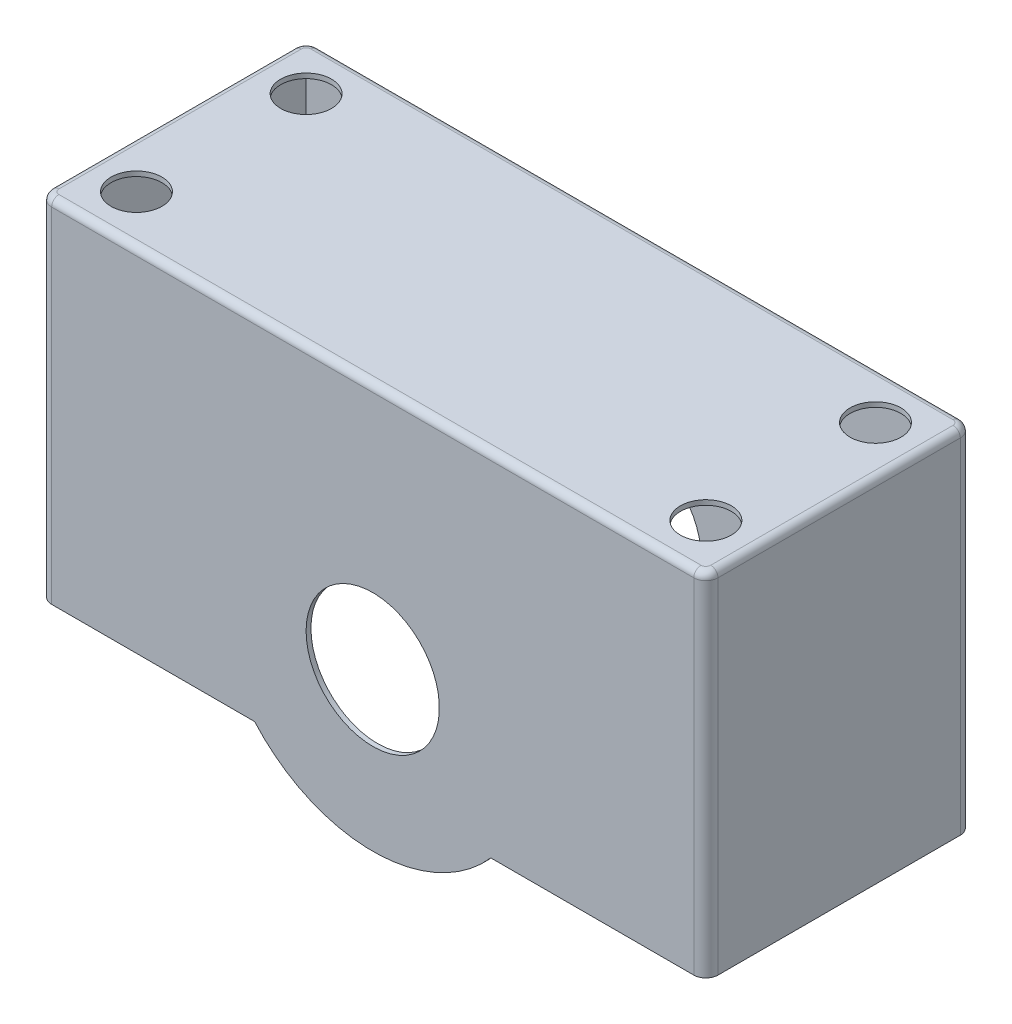
ISO-10303-21;
HEADER;
FILE_DESCRIPTION(('STEP AP214'),'2;1');
FILE_NAME('part.step','',(''),(''),'','','');
FILE_SCHEMA(('AUTOMOTIVE_DESIGN { 1 0 10303 214 1 1 1 1 }'));
ENDSEC;
DATA;
#1=APPLICATION_CONTEXT('core data for automotive mechanical design processes');
#2=APPLICATION_PROTOCOL_DEFINITION('international standard','automotive_design',2000,#1);
#3=PRODUCT_CONTEXT('',#1,'mechanical');
#4=PRODUCT('Part','Part','',(#3));
#5=PRODUCT_RELATED_PRODUCT_CATEGORY('part','',(#4));
#6=PRODUCT_DEFINITION_FORMATION('','',#4);
#7=PRODUCT_DEFINITION_CONTEXT('part definition',#1,'design');
#8=PRODUCT_DEFINITION('design','',#6,#7);
#9=PRODUCT_DEFINITION_SHAPE('','',#8);
#10=(LENGTH_UNIT() NAMED_UNIT(*) SI_UNIT(.MILLI.,.METRE.));
#11=(NAMED_UNIT(*) PLANE_ANGLE_UNIT() SI_UNIT($,.RADIAN.));
#12=(NAMED_UNIT(*) SI_UNIT($,.STERADIAN.) SOLID_ANGLE_UNIT());
#13=UNCERTAINTY_MEASURE_WITH_UNIT(LENGTH_MEASURE(1.E-05),#10,'distance_accuracy_value','');
#14=(GEOMETRIC_REPRESENTATION_CONTEXT(3) GLOBAL_UNCERTAINTY_ASSIGNED_CONTEXT((#13)) GLOBAL_UNIT_ASSIGNED_CONTEXT((#10,
#11,#12)) REPRESENTATION_CONTEXT('',''));
#15=CARTESIAN_POINT('',(0.,0.,0.));
#16=DIRECTION('',(0.,0.,1.));
#17=DIRECTION('',(1.,0.,0.));
#18=AXIS2_PLACEMENT_3D('',#15,#16,#17);
#19=CARTESIAN_POINT('',(-137.5,72.5,55.));
#20=DIRECTION('',(0.,-1.,0.));
#21=DIRECTION('',(0.,0.,-1.));
#22=AXIS2_PLACEMENT_3D('',#19,#20,#21);
#23=PLANE('',#22);
#24=CARTESIAN_POINT('',(-117.5,72.5,35.));
#25=DIRECTION('',(0.,1.,0.));
#26=DIRECTION('',(0.,0.,1.));
#27=AXIS2_PLACEMENT_3D('',#24,#25,#26);
#28=CIRCLE('',#27,10.5);
#29=CARTESIAN_POINT('',(-117.5,72.5,45.5));
#30=VERTEX_POINT('',#29);
#31=EDGE_CURVE('E673',#30,#30,#28,.T.);
#32=ORIENTED_EDGE('',*,*,#31,.F.);
#33=EDGE_LOOP('',(#32));
#34=FACE_BOUND('',#33,.T.);
#35=CARTESIAN_POINT('',(117.5,72.5,-35.));
#36=DIRECTION('',(0.,1.,0.));
#37=DIRECTION('',(0.,0.,-1.));
#38=AXIS2_PLACEMENT_3D('',#35,#36,#37);
#39=CIRCLE('',#38,10.5);
#40=CARTESIAN_POINT('',(117.5,72.5,-45.5));
#41=VERTEX_POINT('',#40);
#42=EDGE_CURVE('E674',#41,#41,#39,.T.);
#43=ORIENTED_EDGE('',*,*,#42,.F.);
#44=EDGE_LOOP('',(#43));
#45=FACE_BOUND('',#44,.T.);
#46=CARTESIAN_POINT('',(117.5,72.5,35.));
#47=DIRECTION('',(0.,1.,0.));
#48=DIRECTION('',(0.,0.,-1.));
#49=AXIS2_PLACEMENT_3D('',#46,#47,#48);
#50=CIRCLE('',#49,10.5);
#51=CARTESIAN_POINT('',(117.5,72.5,24.5));
#52=VERTEX_POINT('',#51);
#53=EDGE_CURVE('E355',#52,#52,#50,.T.);
#54=ORIENTED_EDGE('',*,*,#53,.F.);
#55=EDGE_LOOP('',(#54));
#56=FACE_BOUND('',#55,.T.);
#57=CARTESIAN_POINT('',(-117.5,72.5,-35.));
#58=DIRECTION('',(0.,1.,0.));
#59=DIRECTION('',(0.,0.,1.));
#60=AXIS2_PLACEMENT_3D('',#57,#58,#59);
#61=CIRCLE('',#60,10.5);
#62=CARTESIAN_POINT('',(-117.5,72.5,-24.5));
#63=VERTEX_POINT('',#62);
#64=EDGE_CURVE('E272',#63,#63,#61,.T.);
#65=ORIENTED_EDGE('',*,*,#64,.F.);
#66=EDGE_LOOP('',(#65));
#67=FACE_BOUND('',#66,.T.);
#68=CARTESIAN_POINT('',(-132.5,72.5,50.));
#69=DIRECTION('',(0.,-1.,0.));
#70=DIRECTION('',(0.,0.,-1.));
#71=AXIS2_PLACEMENT_3D('',#68,#69,#70);
#72=CIRCLE('',#71,2.);
#73=CARTESIAN_POINT('',(-132.5,72.5,52.));
#74=VERTEX_POINT('',#73);
#75=CARTESIAN_POINT('',(-134.5,72.5,50.));
#76=VERTEX_POINT('',#75);
#77=EDGE_CURVE('E318',#74,#76,#72,.T.);
#78=ORIENTED_EDGE('',*,*,#77,.F.);
#79=DIRECTION('',(-1.,0.,0.));
#80=VECTOR('',#79,1.);
#81=CARTESIAN_POINT('',(137.5,72.5,52.));
#82=LINE('',#81,#80);
#83=CARTESIAN_POINT('',(132.5,72.5,52.));
#84=VERTEX_POINT('',#83);
#85=EDGE_CURVE('E284',#74,#84,#82,.F.);
#86=ORIENTED_EDGE('',*,*,#85,.T.);
#87=CARTESIAN_POINT('',(132.5,72.5,50.));
#88=DIRECTION('',(0.,-1.,0.));
#89=DIRECTION('',(0.,0.,-1.));
#90=AXIS2_PLACEMENT_3D('',#87,#88,#89);
#91=CIRCLE('',#90,2.);
#92=CARTESIAN_POINT('',(134.5,72.5,50.));
#93=VERTEX_POINT('',#92);
#94=EDGE_CURVE('E316',#93,#84,#91,.T.);
#95=ORIENTED_EDGE('',*,*,#94,.F.);
#96=DIRECTION('',(0.,0.,-1.));
#97=VECTOR('',#96,1.);
#98=CARTESIAN_POINT('',(134.5,72.5,55.));
#99=LINE('',#98,#97);
#100=CARTESIAN_POINT('',(134.5,72.5,-50.));
#101=VERTEX_POINT('',#100);
#102=EDGE_CURVE('E290',#93,#101,#99,.T.);
#103=ORIENTED_EDGE('',*,*,#102,.T.);
#104=CARTESIAN_POINT('',(132.5,72.5,-50.));
#105=DIRECTION('',(0.,-1.,0.));
#106=DIRECTION('',(0.,0.,-1.));
#107=AXIS2_PLACEMENT_3D('',#104,#105,#106);
#108=CIRCLE('',#107,2.);
#109=CARTESIAN_POINT('',(132.5,72.5,-52.));
#110=VERTEX_POINT('',#109);
#111=EDGE_CURVE('E313',#110,#101,#108,.T.);
#112=ORIENTED_EDGE('',*,*,#111,.F.);
#113=DIRECTION('',(-1.,0.,0.));
#114=VECTOR('',#113,1.);
#115=CARTESIAN_POINT('',(-137.5,72.5,-52.));
#116=LINE('',#115,#114);
#117=CARTESIAN_POINT('',(-132.5,72.5,-52.));
#118=VERTEX_POINT('',#117);
#119=EDGE_CURVE('E287',#110,#118,#116,.T.);
#120=ORIENTED_EDGE('',*,*,#119,.T.);
#121=CARTESIAN_POINT('',(-132.5,72.5,-50.));
#122=DIRECTION('',(0.,-1.,0.));
#123=DIRECTION('',(0.,0.,-1.));
#124=AXIS2_PLACEMENT_3D('',#121,#122,#123);
#125=CIRCLE('',#124,2.);
#126=CARTESIAN_POINT('',(-134.5,72.5,-50.));
#127=VERTEX_POINT('',#126);
#128=EDGE_CURVE('E310',#127,#118,#125,.T.);
#129=ORIENTED_EDGE('',*,*,#128,.F.);
#130=DIRECTION('',(0.,0.,-1.));
#131=VECTOR('',#130,1.);
#132=CARTESIAN_POINT('',(-134.5,72.5,55.));
#133=LINE('',#132,#131);
#134=EDGE_CURVE('E264',#127,#76,#133,.F.);
#135=ORIENTED_EDGE('',*,*,#134,.T.);
#136=EDGE_LOOP('',(#78,#86,#95,#103,#112,#120,#129,#135));
#137=FACE_BOUND('',#136,.T.);
#138=ADVANCED_FACE('F40',(#34,#45,#56,#67,#137),#23,.F.);
#139=CARTESIAN_POINT('',(-137.5,-72.5,55.));
#140=DIRECTION('',(0.,1.,0.));
#141=DIRECTION('',(-1.,0.,0.));
#142=AXIS2_PLACEMENT_3D('',#139,#140,#141);
#143=PLANE('',#142);
#144=DIRECTION('',(0.,0.,-1.));
#145=VECTOR('',#144,1.);
#146=CARTESIAN_POINT('',(-137.5,-72.5,55.));
#147=LINE('',#146,#145);
#148=CARTESIAN_POINT('',(-137.5,-72.5,50.));
#149=VERTEX_POINT('',#148);
#150=CARTESIAN_POINT('',(-137.5,-72.5,-50.));
#151=VERTEX_POINT('',#150);
#152=EDGE_CURVE('E261',#149,#151,#147,.T.);
#153=ORIENTED_EDGE('',*,*,#152,.T.);
#154=CARTESIAN_POINT('',(-132.5,-72.5,-50.));
#155=DIRECTION('',(0.,1.,0.));
#156=DIRECTION('',(-1.,0.,0.));
#157=AXIS2_PLACEMENT_3D('',#154,#155,#156);
#158=CIRCLE('',#157,5.);
#159=CARTESIAN_POINT('',(-132.5,-72.5,-55.));
#160=VERTEX_POINT('',#159);
#161=EDGE_CURVE('E339',#151,#160,#158,.F.);
#162=ORIENTED_EDGE('',*,*,#161,.T.);
#163=DIRECTION('',(1.,0.,0.));
#164=VECTOR('',#163,1.);
#165=CARTESIAN_POINT('',(-137.5,-72.5,-55.));
#166=LINE('',#165,#164);
#167=CARTESIAN_POINT('',(-48.7442304278158,-72.5,-55.));
#168=VERTEX_POINT('',#167);
#169=EDGE_CURVE('E226',#160,#168,#166,.T.);
#170=ORIENTED_EDGE('',*,*,#169,.T.);
#171=DIRECTION('',(0.,0.,-1.));
#172=VECTOR('',#171,1.);
#173=CARTESIAN_POINT('',(-48.7442304278158,-72.5,55.));
#174=LINE('',#173,#172);
#175=CARTESIAN_POINT('',(-48.7442304278158,-72.5,-53.));
#176=VERTEX_POINT('',#175);
#177=EDGE_CURVE('E257',#176,#168,#174,.T.);
#178=ORIENTED_EDGE('',*,*,#177,.F.);
#179=DIRECTION('',(1.,0.,0.));
#180=VECTOR('',#179,1.);
#181=CARTESIAN_POINT('',(-137.5,-72.5,-53.));
#182=LINE('',#181,#180);
#183=CARTESIAN_POINT('',(-135.5,-72.5,-53.));
#184=VERTEX_POINT('',#183);
#185=EDGE_CURVE('E206',#184,#176,#182,.T.);
#186=ORIENTED_EDGE('',*,*,#185,.F.);
#187=DIRECTION('',(0.,0.,-1.));
#188=VECTOR('',#187,1.);
#189=CARTESIAN_POINT('',(-135.5,-72.5,55.));
#190=LINE('',#189,#188);
#191=CARTESIAN_POINT('',(-135.5,-72.5,53.));
#192=VERTEX_POINT('',#191);
#193=EDGE_CURVE('E205',#192,#184,#190,.T.);
#194=ORIENTED_EDGE('',*,*,#193,.F.);
#195=DIRECTION('',(1.,0.,0.));
#196=VECTOR('',#195,1.);
#197=CARTESIAN_POINT('',(-137.5,-72.5,53.));
#198=LINE('',#197,#196);
#199=CARTESIAN_POINT('',(-48.7442304278158,-72.5,53.));
#200=VERTEX_POINT('',#199);
#201=EDGE_CURVE('E216',#192,#200,#198,.T.);
#202=ORIENTED_EDGE('',*,*,#201,.T.);
#203=CARTESIAN_POINT('',(-48.7442304278158,-72.5,55.));
#204=VERTEX_POINT('',#203);
#205=EDGE_CURVE('E258',#204,#200,#174,.T.);
#206=ORIENTED_EDGE('',*,*,#205,.F.);
#207=DIRECTION('',(1.,0.,0.));
#208=VECTOR('',#207,1.);
#209=CARTESIAN_POINT('',(-137.5,-72.5,55.));
#210=LINE('',#209,#208);
#211=CARTESIAN_POINT('',(-132.5,-72.5,55.));
#212=VERTEX_POINT('',#211);
#213=EDGE_CURVE('E239',#212,#204,#210,.T.);
#214=ORIENTED_EDGE('',*,*,#213,.F.);
#215=CARTESIAN_POINT('',(-132.5,-72.5,50.));
#216=DIRECTION('',(0.,1.,0.));
#217=DIRECTION('',(-1.,0.,0.));
#218=AXIS2_PLACEMENT_3D('',#215,#216,#217);
#219=CIRCLE('',#218,5.);
#220=EDGE_CURVE('E337',#212,#149,#219,.F.);
#221=ORIENTED_EDGE('',*,*,#220,.T.);
#222=EDGE_LOOP('',(#153,#162,#170,#178,#186,#194,#202,#206,#214,#221));
#223=FACE_BOUND('',#222,.T.);
#224=ADVANCED_FACE('F379',(#223),#143,.F.);
#225=CARTESIAN_POINT('',(0.,-29.5,55.));
#226=DIRECTION('',(0.,0.,-1.));
#227=DIRECTION('',(-1.,0.,0.));
#228=AXIS2_PLACEMENT_3D('',#225,#226,#227);
#229=CYLINDRICAL_SURFACE('',#228,65.);
#230=CARTESIAN_POINT('',(0.,-29.5,-53.));
#231=DIRECTION('',(0.,0.,1.));
#232=DIRECTION('',(1.,0.,0.));
#233=AXIS2_PLACEMENT_3D('',#230,#231,#232);
#234=CIRCLE('',#233,65.);
#235=CARTESIAN_POINT('',(48.7442304278158,-72.5,-53.));
#236=VERTEX_POINT('',#235);
#237=EDGE_CURVE('E209',#176,#236,#234,.T.);
#238=ORIENTED_EDGE('',*,*,#237,.F.);
#239=ORIENTED_EDGE('',*,*,#177,.T.);
#240=CARTESIAN_POINT('',(0.,-29.5,-55.));
#241=DIRECTION('',(0.,0.,1.));
#242=DIRECTION('',(1.,0.,0.));
#243=AXIS2_PLACEMENT_3D('',#240,#241,#242);
#244=CIRCLE('',#243,65.);
#245=CARTESIAN_POINT('',(48.7442304278158,-72.5,-55.));
#246=VERTEX_POINT('',#245);
#247=EDGE_CURVE('E248',#168,#246,#244,.T.);
#248=ORIENTED_EDGE('',*,*,#247,.T.);
#249=DIRECTION('',(0.,0.,-1.));
#250=VECTOR('',#249,1.);
#251=CARTESIAN_POINT('',(48.7442304278158,-72.5,55.));
#252=LINE('',#251,#250);
#253=EDGE_CURVE('E253',#236,#246,#252,.T.);
#254=ORIENTED_EDGE('',*,*,#253,.F.);
#255=EDGE_LOOP('',(#238,#239,#248,#254));
#256=FACE_BOUND('',#255,.T.);
#257=ADVANCED_FACE('F423',(#256),#229,.T.);
#258=CARTESIAN_POINT('',(137.5,-72.5,55.));
#259=DIRECTION('',(0.,1.,0.));
#260=DIRECTION('',(-1.,0.,0.));
#261=AXIS2_PLACEMENT_3D('',#258,#259,#260);
#262=PLANE('',#261);
#263=DIRECTION('',(1.,0.,0.));
#264=VECTOR('',#263,1.);
#265=CARTESIAN_POINT('',(137.5,-72.5,-55.));
#266=LINE('',#265,#264);
#267=CARTESIAN_POINT('',(132.5,-72.5,-55.));
#268=VERTEX_POINT('',#267);
#269=EDGE_CURVE('E242',#246,#268,#266,.T.);
#270=ORIENTED_EDGE('',*,*,#269,.T.);
#271=CARTESIAN_POINT('',(132.5,-72.5,-50.));
#272=DIRECTION('',(0.,1.,0.));
#273=DIRECTION('',(-1.,0.,0.));
#274=AXIS2_PLACEMENT_3D('',#271,#272,#273);
#275=CIRCLE('',#274,5.);
#276=CARTESIAN_POINT('',(137.5,-72.5,-50.));
#277=VERTEX_POINT('',#276);
#278=EDGE_CURVE('E63',#268,#277,#275,.F.);
#279=ORIENTED_EDGE('',*,*,#278,.T.);
#280=DIRECTION('',(0.,0.,-1.));
#281=VECTOR('',#280,1.);
#282=CARTESIAN_POINT('',(137.5,-72.5,55.));
#283=LINE('',#282,#281);
#284=CARTESIAN_POINT('',(137.5,-72.5,50.));
#285=VERTEX_POINT('',#284);
#286=EDGE_CURVE('E246',#285,#277,#283,.T.);
#287=ORIENTED_EDGE('',*,*,#286,.F.);
#288=CARTESIAN_POINT('',(132.5,-72.5,50.));
#289=DIRECTION('',(0.,1.,0.));
#290=DIRECTION('',(-1.,0.,0.));
#291=AXIS2_PLACEMENT_3D('',#288,#289,#290);
#292=CIRCLE('',#291,5.);
#293=CARTESIAN_POINT('',(132.5,-72.5,55.));
#294=VERTEX_POINT('',#293);
#295=EDGE_CURVE('E57',#285,#294,#292,.F.);
#296=ORIENTED_EDGE('',*,*,#295,.T.);
#297=DIRECTION('',(1.,0.,0.));
#298=VECTOR('',#297,1.);
#299=CARTESIAN_POINT('',(137.5,-72.5,55.));
#300=LINE('',#299,#298);
#301=CARTESIAN_POINT('',(48.7442304278158,-72.5,55.));
#302=VERTEX_POINT('',#301);
#303=EDGE_CURVE('E244',#302,#294,#300,.T.);
#304=ORIENTED_EDGE('',*,*,#303,.F.);
#305=CARTESIAN_POINT('',(48.7442304278158,-72.5,53.));
#306=VERTEX_POINT('',#305);
#307=EDGE_CURVE('E254',#302,#306,#252,.T.);
#308=ORIENTED_EDGE('',*,*,#307,.T.);
#309=DIRECTION('',(1.,0.,0.));
#310=VECTOR('',#309,1.);
#311=CARTESIAN_POINT('',(137.5,-72.5,53.));
#312=LINE('',#311,#310);
#313=CARTESIAN_POINT('',(135.5,-72.5,53.));
#314=VERTEX_POINT('',#313);
#315=EDGE_CURVE('E225',#306,#314,#312,.T.);
#316=ORIENTED_EDGE('',*,*,#315,.T.);
#317=DIRECTION('',(0.,0.,-1.));
#318=VECTOR('',#317,1.);
#319=CARTESIAN_POINT('',(135.5,-72.5,55.));
#320=LINE('',#319,#318);
#321=CARTESIAN_POINT('',(135.5,-72.5,-53.));
#322=VERTEX_POINT('',#321);
#323=EDGE_CURVE('E221',#314,#322,#320,.T.);
#324=ORIENTED_EDGE('',*,*,#323,.T.);
#325=DIRECTION('',(1.,0.,0.));
#326=VECTOR('',#325,1.);
#327=CARTESIAN_POINT('',(137.5,-72.5,-53.));
#328=LINE('',#327,#326);
#329=EDGE_CURVE('E223',#236,#322,#328,.T.);
#330=ORIENTED_EDGE('',*,*,#329,.F.);
#331=ORIENTED_EDGE('',*,*,#253,.T.);
#332=EDGE_LOOP('',(#270,#279,#287,#296,#304,#308,#316,#324,#330,#331));
#333=FACE_BOUND('',#332,.T.);
#334=ADVANCED_FACE('F421',(#333),#262,.F.);
#335=CARTESIAN_POINT('',(-137.5,72.5,55.));
#336=DIRECTION('',(1.,0.,0.));
#337=DIRECTION('',(0.,0.,-1.));
#338=AXIS2_PLACEMENT_3D('',#335,#336,#337);
#339=PLANE('',#338);
#340=DIRECTION('',(0.,0.,-1.));
#341=VECTOR('',#340,1.);
#342=CARTESIAN_POINT('',(-137.5,69.5,55.));
#343=LINE('',#342,#341);
#344=CARTESIAN_POINT('',(-137.5,69.5,50.));
#345=VERTEX_POINT('',#344);
#346=CARTESIAN_POINT('',(-137.5,69.5,-50.));
#347=VERTEX_POINT('',#346);
#348=EDGE_CURVE('E302',#345,#347,#343,.T.);
#349=ORIENTED_EDGE('',*,*,#348,.T.);
#350=DIRECTION('',(0.,-1.,0.));
#351=VECTOR('',#350,1.);
#352=CARTESIAN_POINT('',(-137.5,72.5,-50.));
#353=LINE('',#352,#351);
#354=EDGE_CURVE('E335',#347,#151,#353,.T.);
#355=ORIENTED_EDGE('',*,*,#354,.T.);
#356=ORIENTED_EDGE('',*,*,#152,.F.);
#357=DIRECTION('',(0.,-1.,0.));
#358=VECTOR('',#357,1.);
#359=CARTESIAN_POINT('',(-137.5,69.5,50.));
#360=LINE('',#359,#358);
#361=EDGE_CURVE('E333',#149,#345,#360,.F.);
#362=ORIENTED_EDGE('',*,*,#361,.T.);
#363=EDGE_LOOP('',(#349,#355,#356,#362));
#364=FACE_BOUND('',#363,.T.);
#365=ADVANCED_FACE('F375',(#364),#339,.F.);
#366=ORIENTED_EDGE('',*,*,#205,.T.);
#367=CARTESIAN_POINT('',(0.,-29.5,53.));
#368=DIRECTION('',(0.,0.,1.));
#369=DIRECTION('',(1.,0.,0.));
#370=AXIS2_PLACEMENT_3D('',#367,#368,#369);
#371=CIRCLE('',#370,65.);
#372=EDGE_CURVE('E234',#200,#306,#371,.T.);
#373=ORIENTED_EDGE('',*,*,#372,.T.);
#374=ORIENTED_EDGE('',*,*,#307,.F.);
#375=CARTESIAN_POINT('',(0.,-29.5,55.));
#376=DIRECTION('',(0.,0.,1.));
#377=DIRECTION('',(1.,0.,0.));
#378=AXIS2_PLACEMENT_3D('',#375,#376,#377);
#379=CIRCLE('',#378,65.);
#380=EDGE_CURVE('E241',#204,#302,#379,.T.);
#381=ORIENTED_EDGE('',*,*,#380,.F.);
#382=EDGE_LOOP('',(#366,#373,#374,#381));
#383=FACE_BOUND('',#382,.T.);
#384=ADVANCED_FACE('F429',(#383),#229,.T.);
#385=CARTESIAN_POINT('',(137.5,72.5,55.));
#386=DIRECTION('',(-1.,0.,0.));
#387=DIRECTION('',(0.,0.,1.));
#388=AXIS2_PLACEMENT_3D('',#385,#386,#387);
#389=PLANE('',#388);
#390=ORIENTED_EDGE('',*,*,#286,.T.);
#391=DIRECTION('',(0.,1.,0.));
#392=VECTOR('',#391,1.);
#393=CARTESIAN_POINT('',(137.5,72.5,-50.));
#394=LINE('',#393,#392);
#395=CARTESIAN_POINT('',(137.5,69.5,-50.));
#396=VERTEX_POINT('',#395);
#397=EDGE_CURVE('E347',#277,#396,#394,.T.);
#398=ORIENTED_EDGE('',*,*,#397,.T.);
#399=DIRECTION('',(0.,0.,-1.));
#400=VECTOR('',#399,1.);
#401=CARTESIAN_POINT('',(137.5,69.5,55.));
#402=LINE('',#401,#400);
#403=CARTESIAN_POINT('',(137.5,69.5,50.));
#404=VERTEX_POINT('',#403);
#405=EDGE_CURVE('E293',#396,#404,#402,.F.);
#406=ORIENTED_EDGE('',*,*,#405,.T.);
#407=DIRECTION('',(0.,1.,0.));
#408=VECTOR('',#407,1.);
#409=CARTESIAN_POINT('',(137.5,-72.5,50.));
#410=LINE('',#409,#408);
#411=EDGE_CURVE('E345',#404,#285,#410,.F.);
#412=ORIENTED_EDGE('',*,*,#411,.T.);
#413=EDGE_LOOP('',(#390,#398,#406,#412));
#414=FACE_BOUND('',#413,.T.);
#415=ADVANCED_FACE('F408',(#414),#389,.F.);
#416=CARTESIAN_POINT('',(0.,-29.5,55.));
#417=DIRECTION('',(0.,0.,1.));
#418=DIRECTION('',(1.,0.,0.));
#419=AXIS2_PLACEMENT_3D('',#416,#417,#418);
#420=PLANE('',#419);
#421=CARTESIAN_POINT('',(0.,-29.5,55.));
#422=DIRECTION('',(0.,0.,-1.));
#423=DIRECTION('',(-1.,0.,0.));
#424=AXIS2_PLACEMENT_3D('',#421,#422,#423);
#425=CIRCLE('',#424,27.5);
#426=CARTESIAN_POINT('',(-27.5,-29.5,55.));
#427=VERTEX_POINT('',#426);
#428=EDGE_CURVE('E267',#427,#427,#425,.T.);
#429=ORIENTED_EDGE('',*,*,#428,.T.);
#430=EDGE_LOOP('',(#429));
#431=FACE_BOUND('',#430,.T.);
#432=ORIENTED_EDGE('',*,*,#303,.T.);
#433=DIRECTION('',(0.,1.,0.));
#434=VECTOR('',#433,1.);
#435=CARTESIAN_POINT('',(132.5,69.5,55.));
#436=LINE('',#435,#434);
#437=CARTESIAN_POINT('',(132.5,69.5,55.));
#438=VERTEX_POINT('',#437);
#439=EDGE_CURVE('E11',#294,#438,#436,.T.);
#440=ORIENTED_EDGE('',*,*,#439,.T.);
#441=DIRECTION('',(-1.,0.,0.));
#442=VECTOR('',#441,1.);
#443=CARTESIAN_POINT('',(-137.5,69.5,55.));
#444=LINE('',#443,#442);
#445=CARTESIAN_POINT('',(-132.5,69.5,55.));
#446=VERTEX_POINT('',#445);
#447=EDGE_CURVE('E299',#438,#446,#444,.T.);
#448=ORIENTED_EDGE('',*,*,#447,.T.);
#449=DIRECTION('',(0.,-1.,0.));
#450=VECTOR('',#449,1.);
#451=CARTESIAN_POINT('',(-132.5,-72.5,55.));
#452=LINE('',#451,#450);
#453=EDGE_CURVE('E49',#446,#212,#452,.T.);
#454=ORIENTED_EDGE('',*,*,#453,.T.);
#455=ORIENTED_EDGE('',*,*,#213,.T.);
#456=ORIENTED_EDGE('',*,*,#380,.T.);
#457=EDGE_LOOP('',(#432,#440,#448,#454,#455,#456));
#458=FACE_BOUND('',#457,.T.);
#459=ADVANCED_FACE('F447',(#431,#458),#420,.T.);
#460=CARTESIAN_POINT('',(0.,-29.5,-55.));
#461=DIRECTION('',(0.,0.,1.));
#462=DIRECTION('',(1.,0.,0.));
#463=AXIS2_PLACEMENT_3D('',#460,#461,#462);
#464=PLANE('',#463);
#465=CARTESIAN_POINT('',(0.,-29.5,-55.));
#466=DIRECTION('',(0.,0.,-1.));
#467=DIRECTION('',(-1.,0.,0.));
#468=AXIS2_PLACEMENT_3D('',#465,#466,#467);
#469=CIRCLE('',#468,27.5);
#470=CARTESIAN_POINT('',(-27.5,-29.5,-55.));
#471=VERTEX_POINT('',#470);
#472=EDGE_CURVE('E281',#471,#471,#469,.T.);
#473=ORIENTED_EDGE('',*,*,#472,.F.);
#474=EDGE_LOOP('',(#473));
#475=FACE_BOUND('',#474,.T.);
#476=ORIENTED_EDGE('',*,*,#169,.F.);
#477=DIRECTION('',(0.,-1.,0.));
#478=VECTOR('',#477,1.);
#479=CARTESIAN_POINT('',(-132.5,-29.5,-55.));
#480=LINE('',#479,#478);
#481=CARTESIAN_POINT('',(-132.5,69.5,-55.));
#482=VERTEX_POINT('',#481);
#483=EDGE_CURVE('E343',#160,#482,#480,.F.);
#484=ORIENTED_EDGE('',*,*,#483,.T.);
#485=DIRECTION('',(-1.,0.,0.));
#486=VECTOR('',#485,1.);
#487=CARTESIAN_POINT('',(0.,69.5,-55.));
#488=LINE('',#487,#486);
#489=CARTESIAN_POINT('',(132.5,69.5,-55.));
#490=VERTEX_POINT('',#489);
#491=EDGE_CURVE('E296',#482,#490,#488,.F.);
#492=ORIENTED_EDGE('',*,*,#491,.T.);
#493=DIRECTION('',(0.,1.,0.));
#494=VECTOR('',#493,1.);
#495=CARTESIAN_POINT('',(132.5,-29.5,-55.));
#496=LINE('',#495,#494);
#497=EDGE_CURVE('E341',#490,#268,#496,.F.);
#498=ORIENTED_EDGE('',*,*,#497,.T.);
#499=ORIENTED_EDGE('',*,*,#269,.F.);
#500=ORIENTED_EDGE('',*,*,#247,.F.);
#501=EDGE_LOOP('',(#476,#484,#492,#498,#499,#500));
#502=FACE_BOUND('',#501,.T.);
#503=ADVANCED_FACE('F401',(#475,#502),#464,.F.);
#504=CARTESIAN_POINT('',(-135.5,72.5,55.));
#505=DIRECTION('',(1.,0.,0.));
#506=DIRECTION('',(0.,0.,-1.));
#507=AXIS2_PLACEMENT_3D('',#504,#505,#506);
#508=PLANE('',#507);
#509=DIRECTION('',(0.,-1.,0.));
#510=VECTOR('',#509,1.);
#511=CARTESIAN_POINT('',(-135.5,72.5,-53.));
#512=LINE('',#511,#510);
#513=CARTESIAN_POINT('',(-135.5,70.5,-53.));
#514=VERTEX_POINT('',#513);
#515=EDGE_CURVE('E184',#514,#184,#512,.T.);
#516=ORIENTED_EDGE('',*,*,#515,.F.);
#517=DIRECTION('',(0.,0.,-1.));
#518=VECTOR('',#517,1.);
#519=CARTESIAN_POINT('',(-135.5,70.5,55.));
#520=LINE('',#519,#518);
#521=CARTESIAN_POINT('',(-135.5,70.5,53.));
#522=VERTEX_POINT('',#521);
#523=EDGE_CURVE('E194',#522,#514,#520,.T.);
#524=ORIENTED_EDGE('',*,*,#523,.F.);
#525=DIRECTION('',(0.,-1.,0.));
#526=VECTOR('',#525,1.);
#527=CARTESIAN_POINT('',(-135.5,72.5,53.));
#528=LINE('',#527,#526);
#529=EDGE_CURVE('E191',#522,#192,#528,.T.);
#530=ORIENTED_EDGE('',*,*,#529,.T.);
#531=ORIENTED_EDGE('',*,*,#193,.T.);
#532=EDGE_LOOP('',(#516,#524,#530,#531));
#533=FACE_BOUND('',#532,.T.);
#534=ADVANCED_FACE('F203',(#533),#508,.T.);
#535=CARTESIAN_POINT('',(135.5,72.5,55.));
#536=DIRECTION('',(-1.,0.,0.));
#537=DIRECTION('',(0.,0.,1.));
#538=AXIS2_PLACEMENT_3D('',#535,#536,#537);
#539=PLANE('',#538);
#540=DIRECTION('',(0.,1.,0.));
#541=VECTOR('',#540,1.);
#542=CARTESIAN_POINT('',(135.5,72.5,-53.));
#543=LINE('',#542,#541);
#544=CARTESIAN_POINT('',(135.5,70.5,-53.));
#545=VERTEX_POINT('',#544);
#546=EDGE_CURVE('E187',#322,#545,#543,.T.);
#547=ORIENTED_EDGE('',*,*,#546,.F.);
#548=ORIENTED_EDGE('',*,*,#323,.F.);
#549=DIRECTION('',(0.,1.,0.));
#550=VECTOR('',#549,1.);
#551=CARTESIAN_POINT('',(135.5,72.5,53.));
#552=LINE('',#551,#550);
#553=CARTESIAN_POINT('',(135.5,70.5,53.));
#554=VERTEX_POINT('',#553);
#555=EDGE_CURVE('E219',#314,#554,#552,.T.);
#556=ORIENTED_EDGE('',*,*,#555,.T.);
#557=DIRECTION('',(0.,0.,-1.));
#558=VECTOR('',#557,1.);
#559=CARTESIAN_POINT('',(135.5,70.5,55.));
#560=LINE('',#559,#558);
#561=EDGE_CURVE('E201',#554,#545,#560,.T.);
#562=ORIENTED_EDGE('',*,*,#561,.T.);
#563=EDGE_LOOP('',(#547,#548,#556,#562));
#564=FACE_BOUND('',#563,.T.);
#565=ADVANCED_FACE('F602',(#564),#539,.T.);
#566=CARTESIAN_POINT('',(-137.5,70.5,55.));
#567=DIRECTION('',(0.,-1.,0.));
#568=DIRECTION('',(0.,0.,-1.));
#569=AXIS2_PLACEMENT_3D('',#566,#567,#568);
#570=PLANE('',#569);
#571=CARTESIAN_POINT('',(-117.5,70.5,35.));
#572=DIRECTION('',(0.,-1.,0.));
#573=DIRECTION('',(0.,0.,-1.));
#574=AXIS2_PLACEMENT_3D('',#571,#572,#573);
#575=CIRCLE('',#574,10.5);
#576=CARTESIAN_POINT('',(-117.5,70.5,24.5));
#577=VERTEX_POINT('',#576);
#578=EDGE_CURVE('E278',#577,#577,#575,.T.);
#579=ORIENTED_EDGE('',*,*,#578,.F.);
#580=EDGE_LOOP('',(#579));
#581=FACE_BOUND('',#580,.T.);
#582=CARTESIAN_POINT('',(117.5,70.5,-35.));
#583=DIRECTION('',(0.,-1.,0.));
#584=DIRECTION('',(0.,0.,-1.));
#585=AXIS2_PLACEMENT_3D('',#582,#583,#584);
#586=CIRCLE('',#585,10.5);
#587=CARTESIAN_POINT('',(117.5,70.5,-45.5));
#588=VERTEX_POINT('',#587);
#589=EDGE_CURVE('E275',#588,#588,#586,.T.);
#590=ORIENTED_EDGE('',*,*,#589,.F.);
#591=EDGE_LOOP('',(#590));
#592=FACE_BOUND('',#591,.T.);
#593=CARTESIAN_POINT('',(117.5,70.5,35.));
#594=DIRECTION('',(0.,-1.,0.));
#595=DIRECTION('',(0.,0.,-1.));
#596=AXIS2_PLACEMENT_3D('',#593,#594,#595);
#597=CIRCLE('',#596,10.5);
#598=CARTESIAN_POINT('',(117.5,70.5,24.5));
#599=VERTEX_POINT('',#598);
#600=EDGE_CURVE('E271',#599,#599,#597,.T.);
#601=ORIENTED_EDGE('',*,*,#600,.F.);
#602=EDGE_LOOP('',(#601));
#603=FACE_BOUND('',#602,.T.);
#604=CARTESIAN_POINT('',(-117.5,70.5,-35.));
#605=DIRECTION('',(0.,-1.,0.));
#606=DIRECTION('',(0.,0.,-1.));
#607=AXIS2_PLACEMENT_3D('',#604,#605,#606);
#608=CIRCLE('',#607,10.5);
#609=CARTESIAN_POINT('',(-117.5,70.5,-45.5));
#610=VERTEX_POINT('',#609);
#611=EDGE_CURVE('E268',#610,#610,#608,.T.);
#612=ORIENTED_EDGE('',*,*,#611,.F.);
#613=EDGE_LOOP('',(#612));
#614=FACE_BOUND('',#613,.T.);
#615=DIRECTION('',(-1.,0.,0.));
#616=VECTOR('',#615,1.);
#617=CARTESIAN_POINT('',(-137.5,70.5,-53.));
#618=LINE('',#617,#616);
#619=EDGE_CURVE('E180',#545,#514,#618,.T.);
#620=ORIENTED_EDGE('',*,*,#619,.F.);
#621=ORIENTED_EDGE('',*,*,#561,.F.);
#622=DIRECTION('',(-1.,0.,0.));
#623=VECTOR('',#622,1.);
#624=CARTESIAN_POINT('',(-137.5,70.5,53.));
#625=LINE('',#624,#623);
#626=EDGE_CURVE('E197',#554,#522,#625,.T.);
#627=ORIENTED_EDGE('',*,*,#626,.T.);
#628=ORIENTED_EDGE('',*,*,#523,.T.);
#629=EDGE_LOOP('',(#620,#621,#627,#628));
#630=FACE_BOUND('',#629,.T.);
#631=ADVANCED_FACE('F195',(#581,#592,#603,#614,#630),#570,.T.);
#632=CARTESIAN_POINT('',(0.,-29.5,53.));
#633=DIRECTION('',(0.,0.,1.));
#634=DIRECTION('',(1.,0.,0.));
#635=AXIS2_PLACEMENT_3D('',#632,#633,#634);
#636=PLANE('',#635);
#637=CARTESIAN_POINT('',(0.,-29.5,53.));
#638=DIRECTION('',(0.,0.,1.));
#639=DIRECTION('',(1.,0.,0.));
#640=AXIS2_PLACEMENT_3D('',#637,#638,#639);
#641=CIRCLE('',#640,27.5);
#642=CARTESIAN_POINT('',(27.5,-29.5,53.));
#643=VERTEX_POINT('',#642);
#644=EDGE_CURVE('E207',#643,#643,#641,.T.);
#645=ORIENTED_EDGE('',*,*,#644,.T.);
#646=EDGE_LOOP('',(#645));
#647=FACE_BOUND('',#646,.T.);
#648=ORIENTED_EDGE('',*,*,#529,.F.);
#649=ORIENTED_EDGE('',*,*,#626,.F.);
#650=ORIENTED_EDGE('',*,*,#555,.F.);
#651=ORIENTED_EDGE('',*,*,#315,.F.);
#652=ORIENTED_EDGE('',*,*,#372,.F.);
#653=ORIENTED_EDGE('',*,*,#201,.F.);
#654=EDGE_LOOP('',(#648,#649,#650,#651,#652,#653));
#655=FACE_BOUND('',#654,.T.);
#656=ADVANCED_FACE('F586',(#647,#655),#636,.F.);
#657=CARTESIAN_POINT('',(0.,-29.5,-53.));
#658=DIRECTION('',(0.,0.,1.));
#659=DIRECTION('',(1.,0.,0.));
#660=AXIS2_PLACEMENT_3D('',#657,#658,#659);
#661=PLANE('',#660);
#662=CARTESIAN_POINT('',(0.,-29.5,-53.));
#663=DIRECTION('',(0.,0.,1.));
#664=DIRECTION('',(1.,0.,0.));
#665=AXIS2_PLACEMENT_3D('',#662,#663,#664);
#666=CIRCLE('',#665,27.5);
#667=CARTESIAN_POINT('',(27.5,-29.5,-53.));
#668=VERTEX_POINT('',#667);
#669=EDGE_CURVE('E212',#668,#668,#666,.T.);
#670=ORIENTED_EDGE('',*,*,#669,.F.);
#671=EDGE_LOOP('',(#670));
#672=FACE_BOUND('',#671,.T.);
#673=ORIENTED_EDGE('',*,*,#515,.T.);
#674=ORIENTED_EDGE('',*,*,#185,.T.);
#675=ORIENTED_EDGE('',*,*,#237,.T.);
#676=ORIENTED_EDGE('',*,*,#329,.T.);
#677=ORIENTED_EDGE('',*,*,#546,.T.);
#678=ORIENTED_EDGE('',*,*,#619,.T.);
#679=EDGE_LOOP('',(#673,#674,#675,#676,#677,#678));
#680=FACE_BOUND('',#679,.T.);
#681=ADVANCED_FACE('F182',(#672,#680),#661,.T.);
#682=CARTESIAN_POINT('',(0.,-29.5,55.));
#683=DIRECTION('',(0.,0.,-1.));
#684=DIRECTION('',(-1.,0.,0.));
#685=AXIS2_PLACEMENT_3D('',#682,#683,#684);
#686=CYLINDRICAL_SURFACE('',#685,27.5);
#687=ORIENTED_EDGE('',*,*,#669,.T.);
#688=EDGE_LOOP('',(#687));
#689=FACE_BOUND('',#688,.T.);
#690=ORIENTED_EDGE('',*,*,#472,.T.);
#691=EDGE_LOOP('',(#690));
#692=FACE_BOUND('',#691,.T.);
#693=ADVANCED_FACE('F572',(#689,#692),#686,.F.);
#694=ORIENTED_EDGE('',*,*,#428,.F.);
#695=EDGE_LOOP('',(#694));
#696=FACE_BOUND('',#695,.T.);
#697=ORIENTED_EDGE('',*,*,#644,.F.);
#698=EDGE_LOOP('',(#697));
#699=FACE_BOUND('',#698,.T.);
#700=ADVANCED_FACE('F558',(#696,#699),#686,.F.);
#701=CARTESIAN_POINT('',(-117.5,-94.5,-35.));
#702=DIRECTION('',(0.,1.,0.));
#703=DIRECTION('',(0.,0.,1.));
#704=AXIS2_PLACEMENT_3D('',#701,#702,#703);
#705=CYLINDRICAL_SURFACE('',#704,10.5);
#706=ORIENTED_EDGE('',*,*,#611,.T.);
#707=EDGE_LOOP('',(#706));
#708=FACE_BOUND('',#707,.T.);
#709=ORIENTED_EDGE('',*,*,#64,.T.);
#710=EDGE_LOOP('',(#709));
#711=FACE_BOUND('',#710,.T.);
#712=ADVANCED_FACE('F551',(#708,#711),#705,.F.);
#713=CARTESIAN_POINT('',(117.5,-94.5,35.));
#714=DIRECTION('',(0.,1.,0.));
#715=DIRECTION('',(0.,0.,1.));
#716=AXIS2_PLACEMENT_3D('',#713,#714,#715);
#717=CYLINDRICAL_SURFACE('',#716,10.5);
#718=ORIENTED_EDGE('',*,*,#600,.T.);
#719=EDGE_LOOP('',(#718));
#720=FACE_BOUND('',#719,.T.);
#721=ORIENTED_EDGE('',*,*,#53,.T.);
#722=EDGE_LOOP('',(#721));
#723=FACE_BOUND('',#722,.T.);
#724=ADVANCED_FACE('F543',(#720,#723),#717,.F.);
#725=CARTESIAN_POINT('',(117.5,-94.5,-35.));
#726=DIRECTION('',(0.,1.,0.));
#727=DIRECTION('',(0.,0.,1.));
#728=AXIS2_PLACEMENT_3D('',#725,#726,#727);
#729=CYLINDRICAL_SURFACE('',#728,10.5);
#730=ORIENTED_EDGE('',*,*,#589,.T.);
#731=EDGE_LOOP('',(#730));
#732=FACE_BOUND('',#731,.T.);
#733=ORIENTED_EDGE('',*,*,#42,.T.);
#734=EDGE_LOOP('',(#733));
#735=FACE_BOUND('',#734,.T.);
#736=ADVANCED_FACE('F535',(#732,#735),#729,.F.);
#737=CARTESIAN_POINT('',(-117.5,-94.5,35.));
#738=DIRECTION('',(0.,1.,0.));
#739=DIRECTION('',(0.,0.,1.));
#740=AXIS2_PLACEMENT_3D('',#737,#738,#739);
#741=CYLINDRICAL_SURFACE('',#740,10.5);
#742=ORIENTED_EDGE('',*,*,#578,.T.);
#743=EDGE_LOOP('',(#742));
#744=FACE_BOUND('',#743,.T.);
#745=ORIENTED_EDGE('',*,*,#31,.T.);
#746=EDGE_LOOP('',(#745));
#747=FACE_BOUND('',#746,.T.);
#748=ADVANCED_FACE('F468',(#744,#747),#741,.F.);
#749=CARTESIAN_POINT('',(-134.5,69.5,55.));
#750=DIRECTION('',(0.,0.,-1.));
#751=DIRECTION('',(-1.,0.,0.));
#752=AXIS2_PLACEMENT_3D('',#749,#750,#751);
#753=CYLINDRICAL_SURFACE('',#752,3.);
#754=ORIENTED_EDGE('',*,*,#348,.F.);
#755=CARTESIAN_POINT('',(-134.5,69.5,50.));
#756=DIRECTION('',(0.,0.,-1.));
#757=DIRECTION('',(-1.,0.,0.));
#758=AXIS2_PLACEMENT_3D('',#755,#756,#757);
#759=CIRCLE('',#758,3.);
#760=EDGE_CURVE('E307',#345,#76,#759,.T.);
#761=ORIENTED_EDGE('',*,*,#760,.T.);
#762=ORIENTED_EDGE('',*,*,#134,.F.);
#763=CARTESIAN_POINT('',(-134.5,69.5,-50.));
#764=DIRECTION('',(0.,0.,1.));
#765=DIRECTION('',(1.,0.,0.));
#766=AXIS2_PLACEMENT_3D('',#763,#764,#765);
#767=CIRCLE('',#766,3.);
#768=EDGE_CURVE('E305',#127,#347,#767,.T.);
#769=ORIENTED_EDGE('',*,*,#768,.T.);
#770=EDGE_LOOP('',(#754,#761,#762,#769));
#771=FACE_BOUND('',#770,.T.);
#772=ADVANCED_FACE('F390',(#771),#753,.T.);
#773=CARTESIAN_POINT('',(0.,69.5,52.));
#774=DIRECTION('',(1.,0.,0.));
#775=DIRECTION('',(0.,0.,-1.));
#776=AXIS2_PLACEMENT_3D('',#773,#774,#775);
#777=CYLINDRICAL_SURFACE('',#776,3.);
#778=ORIENTED_EDGE('',*,*,#447,.F.);
#779=CARTESIAN_POINT('',(132.5,69.5,52.));
#780=DIRECTION('',(-1.,0.,0.));
#781=DIRECTION('',(0.,0.,1.));
#782=AXIS2_PLACEMENT_3D('',#779,#780,#781);
#783=CIRCLE('',#782,3.);
#784=EDGE_CURVE('E322',#438,#84,#783,.T.);
#785=ORIENTED_EDGE('',*,*,#784,.T.);
#786=ORIENTED_EDGE('',*,*,#85,.F.);
#787=CARTESIAN_POINT('',(-132.5,69.5,52.));
#788=DIRECTION('',(1.,0.,0.));
#789=DIRECTION('',(0.,0.,-1.));
#790=AXIS2_PLACEMENT_3D('',#787,#788,#789);
#791=CIRCLE('',#790,3.);
#792=EDGE_CURVE('E320',#74,#446,#791,.T.);
#793=ORIENTED_EDGE('',*,*,#792,.T.);
#794=EDGE_LOOP('',(#778,#785,#786,#793));
#795=FACE_BOUND('',#794,.T.);
#796=ADVANCED_FACE('F462',(#795),#777,.T.);
#797=CARTESIAN_POINT('',(-137.5,69.5,-52.));
#798=DIRECTION('',(-1.,0.,0.));
#799=DIRECTION('',(0.,0.,1.));
#800=AXIS2_PLACEMENT_3D('',#797,#798,#799);
#801=CYLINDRICAL_SURFACE('',#800,3.);
#802=ORIENTED_EDGE('',*,*,#491,.F.);
#803=CARTESIAN_POINT('',(-132.5,69.5,-52.));
#804=DIRECTION('',(1.,0.,0.));
#805=DIRECTION('',(0.,0.,-1.));
#806=AXIS2_PLACEMENT_3D('',#803,#804,#805);
#807=CIRCLE('',#806,3.);
#808=EDGE_CURVE('E331',#482,#118,#807,.T.);
#809=ORIENTED_EDGE('',*,*,#808,.T.);
#810=ORIENTED_EDGE('',*,*,#119,.F.);
#811=CARTESIAN_POINT('',(132.5,69.5,-52.));
#812=DIRECTION('',(-1.,0.,0.));
#813=DIRECTION('',(0.,0.,1.));
#814=AXIS2_PLACEMENT_3D('',#811,#812,#813);
#815=CIRCLE('',#814,3.);
#816=EDGE_CURVE('E329',#110,#490,#815,.T.);
#817=ORIENTED_EDGE('',*,*,#816,.T.);
#818=EDGE_LOOP('',(#802,#809,#810,#817));
#819=FACE_BOUND('',#818,.T.);
#820=ADVANCED_FACE('F398',(#819),#801,.T.);
#821=CARTESIAN_POINT('',(134.5,69.5,55.));
#822=DIRECTION('',(0.,0.,-1.));
#823=DIRECTION('',(-1.,0.,0.));
#824=AXIS2_PLACEMENT_3D('',#821,#822,#823);
#825=CYLINDRICAL_SURFACE('',#824,3.);
#826=ORIENTED_EDGE('',*,*,#405,.F.);
#827=CARTESIAN_POINT('',(134.5,69.5,-50.));
#828=DIRECTION('',(0.,0.,1.));
#829=DIRECTION('',(1.,0.,0.));
#830=AXIS2_PLACEMENT_3D('',#827,#828,#829);
#831=CIRCLE('',#830,3.);
#832=EDGE_CURVE('E327',#396,#101,#831,.T.);
#833=ORIENTED_EDGE('',*,*,#832,.T.);
#834=ORIENTED_EDGE('',*,*,#102,.F.);
#835=CARTESIAN_POINT('',(134.5,69.5,50.));
#836=DIRECTION('',(0.,0.,-1.));
#837=DIRECTION('',(-1.,0.,0.));
#838=AXIS2_PLACEMENT_3D('',#835,#836,#837);
#839=CIRCLE('',#838,3.);
#840=EDGE_CURVE('E325',#93,#404,#839,.T.);
#841=ORIENTED_EDGE('',*,*,#840,.T.);
#842=EDGE_LOOP('',(#826,#833,#834,#841));
#843=FACE_BOUND('',#842,.T.);
#844=ADVANCED_FACE('F411',(#843),#825,.T.);
#845=CARTESIAN_POINT('',(-132.5,-29.5,50.));
#846=DIRECTION('',(0.,1.,0.));
#847=DIRECTION('',(0.,0.,1.));
#848=AXIS2_PLACEMENT_3D('',#845,#846,#847);
#849=CYLINDRICAL_SURFACE('',#848,5.);
#850=ORIENTED_EDGE('',*,*,#220,.F.);
#851=ORIENTED_EDGE('',*,*,#453,.F.);
#852=CARTESIAN_POINT('',(-132.5,69.5,50.));
#853=DIRECTION('',(0.,-1.,0.));
#854=DIRECTION('',(0.,0.,-1.));
#855=AXIS2_PLACEMENT_3D('',#852,#853,#854);
#856=CIRCLE('',#855,5.);
#857=EDGE_CURVE('E352',#345,#446,#856,.F.);
#858=ORIENTED_EDGE('',*,*,#857,.F.);
#859=ORIENTED_EDGE('',*,*,#361,.F.);
#860=EDGE_LOOP('',(#850,#851,#858,#859));
#861=FACE_BOUND('',#860,.T.);
#862=ADVANCED_FACE('F386',(#861),#849,.T.);
#863=CARTESIAN_POINT('',(-132.5,69.5,50.));
#864=DIRECTION('',(0.,-1.,0.));
#865=DIRECTION('',(0.,0.,-1.));
#866=AXIS2_PLACEMENT_3D('',#863,#864,#865);
#867=DEGENERATE_TOROIDAL_SURFACE('',#866,2.,3.,.T.);
#868=ORIENTED_EDGE('',*,*,#760,.F.);
#869=ORIENTED_EDGE('',*,*,#857,.T.);
#870=ORIENTED_EDGE('',*,*,#792,.F.);
#871=ORIENTED_EDGE('',*,*,#77,.T.);
#872=EDGE_LOOP('',(#868,#869,#870,#871));
#873=FACE_BOUND('',#872,.T.);
#874=ADVANCED_FACE('F469',(#873),#867,.T.);
#875=CARTESIAN_POINT('',(132.5,-29.5,50.));
#876=DIRECTION('',(0.,-1.,0.));
#877=DIRECTION('',(0.,0.,-1.));
#878=AXIS2_PLACEMENT_3D('',#875,#876,#877);
#879=CYLINDRICAL_SURFACE('',#878,5.);
#880=ORIENTED_EDGE('',*,*,#295,.F.);
#881=ORIENTED_EDGE('',*,*,#411,.F.);
#882=CARTESIAN_POINT('',(132.5,69.5,50.));
#883=DIRECTION('',(0.,-1.,0.));
#884=DIRECTION('',(0.,0.,-1.));
#885=AXIS2_PLACEMENT_3D('',#882,#883,#884);
#886=CIRCLE('',#885,5.);
#887=EDGE_CURVE('E356',#438,#404,#886,.F.);
#888=ORIENTED_EDGE('',*,*,#887,.F.);
#889=ORIENTED_EDGE('',*,*,#439,.F.);
#890=EDGE_LOOP('',(#880,#881,#888,#889));
#891=FACE_BOUND('',#890,.T.);
#892=ADVANCED_FACE('F420',(#891),#879,.T.);
#893=CARTESIAN_POINT('',(132.5,69.5,50.));
#894=DIRECTION('',(0.,-1.,0.));
#895=DIRECTION('',(0.,0.,-1.));
#896=AXIS2_PLACEMENT_3D('',#893,#894,#895);
#897=DEGENERATE_TOROIDAL_SURFACE('',#896,2.,3.,.T.);
#898=ORIENTED_EDGE('',*,*,#784,.F.);
#899=ORIENTED_EDGE('',*,*,#887,.T.);
#900=ORIENTED_EDGE('',*,*,#840,.F.);
#901=ORIENTED_EDGE('',*,*,#94,.T.);
#902=EDGE_LOOP('',(#898,#899,#900,#901));
#903=FACE_BOUND('',#902,.T.);
#904=ADVANCED_FACE('F416',(#903),#897,.T.);
#905=CARTESIAN_POINT('',(132.5,72.5,-50.));
#906=DIRECTION('',(0.,1.,0.));
#907=DIRECTION('',(0.,0.,1.));
#908=AXIS2_PLACEMENT_3D('',#905,#906,#907);
#909=CYLINDRICAL_SURFACE('',#908,5.);
#910=ORIENTED_EDGE('',*,*,#278,.F.);
#911=ORIENTED_EDGE('',*,*,#497,.F.);
#912=CARTESIAN_POINT('',(132.5,69.5,-50.));
#913=DIRECTION('',(0.,-1.,0.));
#914=DIRECTION('',(0.,0.,-1.));
#915=AXIS2_PLACEMENT_3D('',#912,#913,#914);
#916=CIRCLE('',#915,5.);
#917=EDGE_CURVE('E358',#396,#490,#916,.F.);
#918=ORIENTED_EDGE('',*,*,#917,.F.);
#919=ORIENTED_EDGE('',*,*,#397,.F.);
#920=EDGE_LOOP('',(#910,#911,#918,#919));
#921=FACE_BOUND('',#920,.T.);
#922=ADVANCED_FACE('F404',(#921),#909,.T.);
#923=CARTESIAN_POINT('',(132.5,69.5,-50.));
#924=DIRECTION('',(0.,-1.,0.));
#925=DIRECTION('',(0.,0.,-1.));
#926=AXIS2_PLACEMENT_3D('',#923,#924,#925);
#927=DEGENERATE_TOROIDAL_SURFACE('',#926,2.,3.,.T.);
#928=ORIENTED_EDGE('',*,*,#816,.F.);
#929=ORIENTED_EDGE('',*,*,#111,.T.);
#930=ORIENTED_EDGE('',*,*,#832,.F.);
#931=ORIENTED_EDGE('',*,*,#917,.T.);
#932=EDGE_LOOP('',(#928,#929,#930,#931));
#933=FACE_BOUND('',#932,.T.);
#934=ADVANCED_FACE('F479',(#933),#927,.T.);
#935=CARTESIAN_POINT('',(-132.5,72.5,-50.));
#936=DIRECTION('',(0.,-1.,0.));
#937=DIRECTION('',(0.,0.,-1.));
#938=AXIS2_PLACEMENT_3D('',#935,#936,#937);
#939=CYLINDRICAL_SURFACE('',#938,5.);
#940=ORIENTED_EDGE('',*,*,#161,.F.);
#941=ORIENTED_EDGE('',*,*,#354,.F.);
#942=CARTESIAN_POINT('',(-132.5,69.5,-50.));
#943=DIRECTION('',(0.,-1.,0.));
#944=DIRECTION('',(0.,0.,-1.));
#945=AXIS2_PLACEMENT_3D('',#942,#943,#944);
#946=CIRCLE('',#945,5.);
#947=EDGE_CURVE('E44',#482,#347,#946,.F.);
#948=ORIENTED_EDGE('',*,*,#947,.F.);
#949=ORIENTED_EDGE('',*,*,#483,.F.);
#950=EDGE_LOOP('',(#940,#941,#948,#949));
#951=FACE_BOUND('',#950,.T.);
#952=ADVANCED_FACE('F42',(#951),#939,.T.);
#953=CARTESIAN_POINT('',(-132.5,69.5,-50.));
#954=DIRECTION('',(0.,-1.,0.));
#955=DIRECTION('',(0.,0.,-1.));
#956=AXIS2_PLACEMENT_3D('',#953,#954,#955);
#957=DEGENERATE_TOROIDAL_SURFACE('',#956,2.,3.,.T.);
#958=ORIENTED_EDGE('',*,*,#768,.F.);
#959=ORIENTED_EDGE('',*,*,#128,.T.);
#960=ORIENTED_EDGE('',*,*,#808,.F.);
#961=ORIENTED_EDGE('',*,*,#947,.T.);
#962=EDGE_LOOP('',(#958,#959,#960,#961));
#963=FACE_BOUND('',#962,.T.);
#964=ADVANCED_FACE('F367',(#963),#957,.T.);
#965=CLOSED_SHELL('',(#138,#224,#257,#334,#365,#384,#415,#459,#503,#534,#565,#631,#656,#681,
#693,#700,#712,#724,#736,#748,#772,#796,#820,#844,#862,#874,#892,#904,#922,#934,#952,#964));
#966=MANIFOLD_SOLID_BREP('B2',#965);
#967=ADVANCED_BREP_SHAPE_REPRESENTATION('',(#18,#966),#14);
#968=SHAPE_DEFINITION_REPRESENTATION(#9,#967);
ENDSEC;
END-ISO-10303-21;
